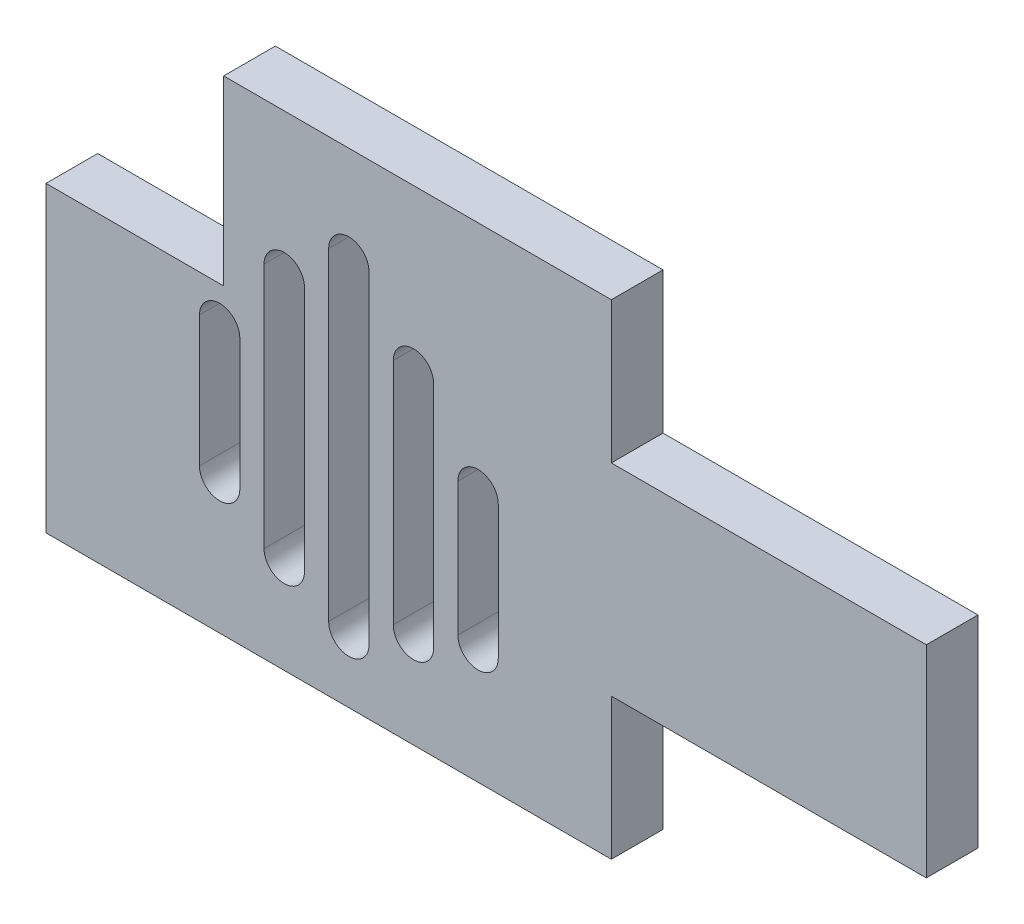
ISO-10303-21;
HEADER;
FILE_DESCRIPTION(('STEP AP214'),'2;1');
FILE_NAME('part.step','',(''),(''),'','','');
FILE_SCHEMA(('AUTOMOTIVE_DESIGN { 1 0 10303 214 1 1 1 1 }'));
ENDSEC;
DATA;
#1=APPLICATION_CONTEXT('core data for automotive mechanical design processes');
#2=APPLICATION_PROTOCOL_DEFINITION('international standard','automotive_design',2000,#1);
#3=PRODUCT_CONTEXT('',#1,'mechanical');
#4=PRODUCT('Part','Part','',(#3));
#5=PRODUCT_RELATED_PRODUCT_CATEGORY('part','',(#4));
#6=PRODUCT_DEFINITION_FORMATION('','',#4);
#7=PRODUCT_DEFINITION_CONTEXT('part definition',#1,'design');
#8=PRODUCT_DEFINITION('design','',#6,#7);
#9=PRODUCT_DEFINITION_SHAPE('','',#8);
#10=(LENGTH_UNIT() NAMED_UNIT(*) SI_UNIT(.MILLI.,.METRE.));
#11=(NAMED_UNIT(*) PLANE_ANGLE_UNIT() SI_UNIT($,.RADIAN.));
#12=(NAMED_UNIT(*) SI_UNIT($,.STERADIAN.) SOLID_ANGLE_UNIT());
#13=UNCERTAINTY_MEASURE_WITH_UNIT(LENGTH_MEASURE(1.E-05),#10,'distance_accuracy_value','');
#14=(GEOMETRIC_REPRESENTATION_CONTEXT(3) GLOBAL_UNCERTAINTY_ASSIGNED_CONTEXT((#13)) GLOBAL_UNIT_ASSIGNED_CONTEXT((#10,
#11,#12)) REPRESENTATION_CONTEXT('',''));
#15=CARTESIAN_POINT('',(0.,0.,0.));
#16=DIRECTION('',(0.,0.,1.));
#17=DIRECTION('',(1.,0.,0.));
#18=AXIS2_PLACEMENT_3D('',#15,#16,#17);
#19=CARTESIAN_POINT('',(0.,0.,6.4));
#20=DIRECTION('',(0.,0.,1.));
#21=DIRECTION('',(1.,0.,0.));
#22=AXIS2_PLACEMENT_3D('',#19,#20,#21);
#23=PLANE('',#22);
#24=DIRECTION('',(1.,0.,0.));
#25=VECTOR('',#24,1.);
#26=CARTESIAN_POINT('',(30.8627181714712,-9.00594586937473,6.4));
#27=LINE('',#26,#25);
#28=CARTESIAN_POINT('',(-39.1372818285288,-9.00594586937474,6.4));
#29=VERTEX_POINT('',#28);
#30=CARTESIAN_POINT('',(30.8627181714712,-9.00594586937473,6.4));
#31=VERTEX_POINT('',#30);
#32=EDGE_CURVE('E390',#29,#31,#27,.T.);
#33=ORIENTED_EDGE('',*,*,#32,.T.);
#34=DIRECTION('',(0.,1.,0.));
#35=VECTOR('',#34,1.);
#36=CARTESIAN_POINT('',(30.8627181714712,8.49405413062527,6.4));
#37=LINE('',#36,#35);
#38=CARTESIAN_POINT('',(30.8627181714712,8.49405413062527,6.4));
#39=VERTEX_POINT('',#38);
#40=EDGE_CURVE('E393',#31,#39,#37,.T.);
#41=ORIENTED_EDGE('',*,*,#40,.T.);
#42=DIRECTION('',(1.,0.,0.));
#43=VECTOR('',#42,1.);
#44=CARTESIAN_POINT('',(30.8627181714712,8.49405413062527,6.4));
#45=LINE('',#44,#43);
#46=CARTESIAN_POINT('',(69.8627181714712,8.49405413062527,6.4));
#47=VERTEX_POINT('',#46);
#48=EDGE_CURVE('E396',#39,#47,#45,.T.);
#49=ORIENTED_EDGE('',*,*,#48,.T.);
#50=DIRECTION('',(0.,1.,0.));
#51=VECTOR('',#50,1.);
#52=CARTESIAN_POINT('',(69.8627181714712,33.4940541306253,6.4));
#53=LINE('',#52,#51);
#54=CARTESIAN_POINT('',(69.8627181714712,33.4940541306253,6.4));
#55=VERTEX_POINT('',#54);
#56=EDGE_CURVE('E398',#47,#55,#53,.T.);
#57=ORIENTED_EDGE('',*,*,#56,.T.);
#58=DIRECTION('',(-1.,0.,0.));
#59=VECTOR('',#58,1.);
#60=CARTESIAN_POINT('',(30.8627181714712,33.4940541306253,6.4));
#61=LINE('',#60,#59);
#62=CARTESIAN_POINT('',(30.8627181714712,33.4940541306253,6.4));
#63=VERTEX_POINT('',#62);
#64=EDGE_CURVE('E400',#55,#63,#61,.T.);
#65=ORIENTED_EDGE('',*,*,#64,.T.);
#66=DIRECTION('',(0.,1.,0.));
#67=VECTOR('',#66,1.);
#68=CARTESIAN_POINT('',(30.8627181714712,50.9940541306253,6.4));
#69=LINE('',#68,#67);
#70=CARTESIAN_POINT('',(30.8627181714712,50.9940541306253,6.4));
#71=VERTEX_POINT('',#70);
#72=EDGE_CURVE('E402',#63,#71,#69,.T.);
#73=ORIENTED_EDGE('',*,*,#72,.T.);
#74=DIRECTION('',(-1.,0.,0.));
#75=VECTOR('',#74,1.);
#76=CARTESIAN_POINT('',(30.8627181714712,50.9940541306253,6.4));
#77=LINE('',#76,#75);
#78=CARTESIAN_POINT('',(-17.1372818285288,50.9940541306253,6.4));
#79=VERTEX_POINT('',#78);
#80=EDGE_CURVE('E404',#71,#79,#77,.T.);
#81=ORIENTED_EDGE('',*,*,#80,.T.);
#82=DIRECTION('',(0.,-1.,0.));
#83=VECTOR('',#82,1.);
#84=CARTESIAN_POINT('',(-17.1372818285288,50.9940541306253,6.4));
#85=LINE('',#84,#83);
#86=CARTESIAN_POINT('',(-17.1372818285288,28.4723046370912,6.4));
#87=VERTEX_POINT('',#86);
#88=EDGE_CURVE('E406',#79,#87,#85,.T.);
#89=ORIENTED_EDGE('',*,*,#88,.T.);
#90=DIRECTION('',(-1.,0.,0.));
#91=VECTOR('',#90,1.);
#92=CARTESIAN_POINT('',(-17.1372818285288,28.4723046370912,6.4));
#93=LINE('',#92,#91);
#94=CARTESIAN_POINT('',(-39.1372818285288,28.4723046370912,6.4));
#95=VERTEX_POINT('',#94);
#96=EDGE_CURVE('E408',#87,#95,#93,.T.);
#97=ORIENTED_EDGE('',*,*,#96,.T.);
#98=DIRECTION('',(0.,-1.,0.));
#99=VECTOR('',#98,1.);
#100=CARTESIAN_POINT('',(-39.1372818285288,28.4723046370912,6.4));
#101=LINE('',#100,#99);
#102=EDGE_CURVE('E410',#95,#29,#101,.T.);
#103=ORIENTED_EDGE('',*,*,#102,.T.);
#104=EDGE_LOOP('',(#33,#41,#49,#57,#65,#73,#81,#89,#97,#103));
#105=FACE_BOUND('',#104,.T.);
#106=DIRECTION('',(0.,-1.,0.));
#107=VECTOR('',#106,1.);
#108=CARTESIAN_POINT('',(-4.13728182852882,38.9940541306252,6.4));
#109=LINE('',#108,#107);
#110=CARTESIAN_POINT('',(-4.13728182852882,38.9940541306252,6.4));
#111=VERTEX_POINT('',#110);
#112=CARTESIAN_POINT('',(-4.13728182852882,-1.00594586937475,6.4));
#113=VERTEX_POINT('',#112);
#114=EDGE_CURVE('E361',#111,#113,#109,.T.);
#115=ORIENTED_EDGE('',*,*,#114,.F.);
#116=CARTESIAN_POINT('',(-1.63728182852882,38.9940541306252,6.4));
#117=DIRECTION('',(0.,0.,1.));
#118=DIRECTION('',(-1.,0.,0.));
#119=AXIS2_PLACEMENT_3D('',#116,#117,#118);
#120=CIRCLE('',#119,2.5);
#121=CARTESIAN_POINT('',(0.862718171471179,38.9940541306252,6.4));
#122=VERTEX_POINT('',#121);
#123=EDGE_CURVE('E359',#122,#111,#120,.T.);
#124=ORIENTED_EDGE('',*,*,#123,.F.);
#125=DIRECTION('',(0.,1.,0.));
#126=VECTOR('',#125,1.);
#127=CARTESIAN_POINT('',(0.862718171471179,38.9940541306252,6.4));
#128=LINE('',#127,#126);
#129=CARTESIAN_POINT('',(0.862718171471179,-1.00594586937475,6.4));
#130=VERTEX_POINT('',#129);
#131=EDGE_CURVE('E367',#130,#122,#128,.T.);
#132=ORIENTED_EDGE('',*,*,#131,.F.);
#133=CARTESIAN_POINT('',(-1.63728182852882,-1.00594586937475,6.4));
#134=DIRECTION('',(0.,0.,1.));
#135=DIRECTION('',(-1.,0.,0.));
#136=AXIS2_PLACEMENT_3D('',#133,#134,#135);
#137=CIRCLE('',#136,2.5);
#138=EDGE_CURVE('E364',#113,#130,#137,.T.);
#139=ORIENTED_EDGE('',*,*,#138,.F.);
#140=EDGE_LOOP('',(#115,#124,#132,#139));
#141=FACE_BOUND('',#140,.T.);
#142=DIRECTION('',(0.,-1.,0.));
#143=VECTOR('',#142,1.);
#144=CARTESIAN_POINT('',(-12.1372818285288,33.3124319025332,6.4));
#145=LINE('',#144,#143);
#146=CARTESIAN_POINT('',(-12.1372818285288,33.3124319025332,6.4));
#147=VERTEX_POINT('',#146);
#148=CARTESIAN_POINT('',(-12.1372818285288,2.80982789630503,6.4));
#149=VERTEX_POINT('',#148);
#150=EDGE_CURVE('E330',#147,#149,#145,.T.);
#151=ORIENTED_EDGE('',*,*,#150,.F.);
#152=CARTESIAN_POINT('',(-9.63728182852882,33.3124319025332,6.4));
#153=DIRECTION('',(0.,0.,1.));
#154=DIRECTION('',(-1.,0.,0.));
#155=AXIS2_PLACEMENT_3D('',#152,#153,#154);
#156=CIRCLE('',#155,2.5);
#157=CARTESIAN_POINT('',(-7.13728182852882,33.3124319025332,6.4));
#158=VERTEX_POINT('',#157);
#159=EDGE_CURVE('E328',#158,#147,#156,.T.);
#160=ORIENTED_EDGE('',*,*,#159,.F.);
#161=DIRECTION('',(0.,1.,0.));
#162=VECTOR('',#161,1.);
#163=CARTESIAN_POINT('',(-7.13728182852882,33.3124319025332,6.4));
#164=LINE('',#163,#162);
#165=CARTESIAN_POINT('',(-7.13728182852882,2.80982789630503,6.4));
#166=VERTEX_POINT('',#165);
#167=EDGE_CURVE('E336',#166,#158,#164,.T.);
#168=ORIENTED_EDGE('',*,*,#167,.F.);
#169=CARTESIAN_POINT('',(-9.63728182852882,2.80982789630503,6.4));
#170=DIRECTION('',(0.,0.,1.));
#171=DIRECTION('',(1.,0.,0.));
#172=AXIS2_PLACEMENT_3D('',#169,#170,#171);
#173=CIRCLE('',#172,2.5);
#174=EDGE_CURVE('E333',#149,#166,#173,.T.);
#175=ORIENTED_EDGE('',*,*,#174,.F.);
#176=EDGE_LOOP('',(#151,#160,#168,#175));
#177=FACE_BOUND('',#176,.T.);
#178=DIRECTION('',(0.,-1.,0.));
#179=VECTOR('',#178,1.);
#180=CARTESIAN_POINT('',(-20.1372818285288,23.8612835886495,6.4));
#181=LINE('',#180,#179);
#182=CARTESIAN_POINT('',(-20.1372818285288,23.8612835886495,6.4));
#183=VERTEX_POINT('',#182);
#184=CARTESIAN_POINT('',(-20.1372818285288,7.68344946237683,6.4));
#185=VERTEX_POINT('',#184);
#186=EDGE_CURVE('E299',#183,#185,#181,.T.);
#187=ORIENTED_EDGE('',*,*,#186,.F.);
#188=CARTESIAN_POINT('',(-17.6372818285288,23.8612835886495,6.4));
#189=DIRECTION('',(0.,0.,1.));
#190=DIRECTION('',(1.,0.,0.));
#191=AXIS2_PLACEMENT_3D('',#188,#189,#190);
#192=CIRCLE('',#191,2.5);
#193=CARTESIAN_POINT('',(-15.1372818285288,23.8612835886495,6.4));
#194=VERTEX_POINT('',#193);
#195=EDGE_CURVE('E297',#194,#183,#192,.T.);
#196=ORIENTED_EDGE('',*,*,#195,.F.);
#197=DIRECTION('',(0.,1.,0.));
#198=VECTOR('',#197,1.);
#199=CARTESIAN_POINT('',(-15.1372818285288,23.8612835886495,6.4));
#200=LINE('',#199,#198);
#201=CARTESIAN_POINT('',(-15.1372818285288,7.68344946237683,6.4));
#202=VERTEX_POINT('',#201);
#203=EDGE_CURVE('E305',#202,#194,#200,.T.);
#204=ORIENTED_EDGE('',*,*,#203,.F.);
#205=CARTESIAN_POINT('',(-17.6372818285288,7.68344946237683,6.4));
#206=DIRECTION('',(0.,0.,1.));
#207=DIRECTION('',(1.,0.,0.));
#208=AXIS2_PLACEMENT_3D('',#205,#206,#207);
#209=CIRCLE('',#208,2.5);
#210=EDGE_CURVE('E302',#185,#202,#209,.T.);
#211=ORIENTED_EDGE('',*,*,#210,.F.);
#212=EDGE_LOOP('',(#187,#196,#204,#211));
#213=FACE_BOUND('',#212,.T.);
#214=DIRECTION('',(0.,-1.,0.));
#215=VECTOR('',#214,1.);
#216=CARTESIAN_POINT('',(3.86271817147118,30.9940541306252,6.4));
#217=LINE('',#216,#215);
#218=CARTESIAN_POINT('',(3.86271817147118,30.9940541306252,6.4));
#219=VERTEX_POINT('',#218);
#220=CARTESIAN_POINT('',(3.86271817147118,2.64743444309961,6.4));
#221=VERTEX_POINT('',#220);
#222=EDGE_CURVE('E268',#219,#221,#217,.T.);
#223=ORIENTED_EDGE('',*,*,#222,.F.);
#224=CARTESIAN_POINT('',(6.36271817147118,30.9940541306252,6.4));
#225=DIRECTION('',(0.,0.,1.));
#226=DIRECTION('',(1.,0.,0.));
#227=AXIS2_PLACEMENT_3D('',#224,#225,#226);
#228=CIRCLE('',#227,2.5);
#229=CARTESIAN_POINT('',(8.86271817147118,30.9940541306252,6.4));
#230=VERTEX_POINT('',#229);
#231=EDGE_CURVE('E266',#230,#219,#228,.T.);
#232=ORIENTED_EDGE('',*,*,#231,.F.);
#233=DIRECTION('',(0.,1.,0.));
#234=VECTOR('',#233,1.);
#235=CARTESIAN_POINT('',(8.86271817147118,30.9940541306252,6.4));
#236=LINE('',#235,#234);
#237=CARTESIAN_POINT('',(8.86271817147118,2.64743444309961,6.4));
#238=VERTEX_POINT('',#237);
#239=EDGE_CURVE('E274',#238,#230,#236,.T.);
#240=ORIENTED_EDGE('',*,*,#239,.F.);
#241=CARTESIAN_POINT('',(6.36271817147118,2.64743444309961,6.4));
#242=DIRECTION('',(0.,0.,1.));
#243=DIRECTION('',(1.,0.,0.));
#244=AXIS2_PLACEMENT_3D('',#241,#242,#243);
#245=CIRCLE('',#244,2.5);
#246=EDGE_CURVE('E271',#221,#238,#245,.T.);
#247=ORIENTED_EDGE('',*,*,#246,.F.);
#248=EDGE_LOOP('',(#223,#232,#240,#247));
#249=FACE_BOUND('',#248,.T.);
#250=DIRECTION('',(0.,-1.,0.));
#251=VECTOR('',#250,1.);
#252=CARTESIAN_POINT('',(11.8627181714712,22.0482710062122,6.4));
#253=LINE('',#252,#251);
#254=CARTESIAN_POINT('',(11.8627181714712,22.0482710062122,6.4));
#255=VERTEX_POINT('',#254);
#256=CARTESIAN_POINT('',(11.8627181714712,5.53847301170768,6.4));
#257=VERTEX_POINT('',#256);
#258=EDGE_CURVE('E238',#255,#257,#253,.T.);
#259=ORIENTED_EDGE('',*,*,#258,.F.);
#260=CARTESIAN_POINT('',(14.3627181714712,22.0482710062122,6.4));
#261=DIRECTION('',(0.,0.,1.));
#262=DIRECTION('',(1.,0.,0.));
#263=AXIS2_PLACEMENT_3D('',#260,#261,#262);
#264=CIRCLE('',#263,2.5);
#265=CARTESIAN_POINT('',(16.8627181714712,22.0482710062122,6.4));
#266=VERTEX_POINT('',#265);
#267=EDGE_CURVE('E230',#266,#255,#264,.T.);
#268=ORIENTED_EDGE('',*,*,#267,.F.);
#269=DIRECTION('',(0.,1.,0.));
#270=VECTOR('',#269,1.);
#271=CARTESIAN_POINT('',(16.8627181714712,22.0482710062122,6.4));
#272=LINE('',#271,#270);
#273=CARTESIAN_POINT('',(16.8627181714712,5.53847301170768,6.4));
#274=VERTEX_POINT('',#273);
#275=EDGE_CURVE('E252',#274,#266,#272,.T.);
#276=ORIENTED_EDGE('',*,*,#275,.F.);
#277=CARTESIAN_POINT('',(14.3627181714712,5.53847301170768,6.4));
#278=DIRECTION('',(0.,0.,1.));
#279=DIRECTION('',(1.,0.,0.));
#280=AXIS2_PLACEMENT_3D('',#277,#278,#279);
#281=CIRCLE('',#280,2.5);
#282=EDGE_CURVE('E250',#257,#274,#281,.T.);
#283=ORIENTED_EDGE('',*,*,#282,.F.);
#284=EDGE_LOOP('',(#259,#268,#276,#283));
#285=FACE_BOUND('',#284,.T.);
#286=ADVANCED_FACE('F33',(#105,#141,#177,#213,#249,#285),#23,.T.);
#287=CARTESIAN_POINT('',(0.,0.,0.));
#288=DIRECTION('',(0.,0.,1.));
#289=DIRECTION('',(1.,0.,0.));
#290=AXIS2_PLACEMENT_3D('',#287,#288,#289);
#291=PLANE('',#290);
#292=CARTESIAN_POINT('',(6.36271817147118,30.9940541306252,0.));
#293=DIRECTION('',(0.,0.,1.));
#294=DIRECTION('',(1.,0.,0.));
#295=AXIS2_PLACEMENT_3D('',#292,#293,#294);
#296=CIRCLE('',#295,2.5);
#297=CARTESIAN_POINT('',(8.86271817147118,30.9940541306252,0.));
#298=VERTEX_POINT('',#297);
#299=CARTESIAN_POINT('',(3.86271817147118,30.9940541306252,0.));
#300=VERTEX_POINT('',#299);
#301=EDGE_CURVE('E246',#298,#300,#296,.T.);
#302=ORIENTED_EDGE('',*,*,#301,.T.);
#303=DIRECTION('',(0.,-1.,0.));
#304=VECTOR('',#303,1.);
#305=CARTESIAN_POINT('',(3.86271817147118,30.9940541306252,0.));
#306=LINE('',#305,#304);
#307=CARTESIAN_POINT('',(3.86271817147118,2.64743444309961,0.));
#308=VERTEX_POINT('',#307);
#309=EDGE_CURVE('E279',#300,#308,#306,.T.);
#310=ORIENTED_EDGE('',*,*,#309,.T.);
#311=CARTESIAN_POINT('',(6.36271817147118,2.64743444309961,0.));
#312=DIRECTION('',(0.,0.,1.));
#313=DIRECTION('',(1.,0.,0.));
#314=AXIS2_PLACEMENT_3D('',#311,#312,#313);
#315=CIRCLE('',#314,2.5);
#316=CARTESIAN_POINT('',(8.86271817147118,2.64743444309961,0.));
#317=VERTEX_POINT('',#316);
#318=EDGE_CURVE('E282',#308,#317,#315,.T.);
#319=ORIENTED_EDGE('',*,*,#318,.T.);
#320=DIRECTION('',(0.,1.,0.));
#321=VECTOR('',#320,1.);
#322=CARTESIAN_POINT('',(8.86271817147118,30.9940541306252,0.));
#323=LINE('',#322,#321);
#324=EDGE_CURVE('E269',#317,#298,#323,.T.);
#325=ORIENTED_EDGE('',*,*,#324,.T.);
#326=EDGE_LOOP('',(#302,#310,#319,#325));
#327=FACE_BOUND('',#326,.T.);
#328=CARTESIAN_POINT('',(-9.63728182852882,33.3124319025332,0.));
#329=DIRECTION('',(0.,0.,1.));
#330=DIRECTION('',(-1.,0.,0.));
#331=AXIS2_PLACEMENT_3D('',#328,#329,#330);
#332=CIRCLE('',#331,2.5);
#333=CARTESIAN_POINT('',(-7.13728182852882,33.3124319025332,0.));
#334=VERTEX_POINT('',#333);
#335=CARTESIAN_POINT('',(-12.1372818285288,33.3124319025332,0.));
#336=VERTEX_POINT('',#335);
#337=EDGE_CURVE('E327',#334,#336,#332,.T.);
#338=ORIENTED_EDGE('',*,*,#337,.T.);
#339=DIRECTION('',(0.,-1.,0.));
#340=VECTOR('',#339,1.);
#341=CARTESIAN_POINT('',(-12.1372818285288,33.3124319025332,0.));
#342=LINE('',#341,#340);
#343=CARTESIAN_POINT('',(-12.1372818285288,2.80982789630503,0.));
#344=VERTEX_POINT('',#343);
#345=EDGE_CURVE('E341',#336,#344,#342,.T.);
#346=ORIENTED_EDGE('',*,*,#345,.T.);
#347=CARTESIAN_POINT('',(-9.63728182852882,2.80982789630503,0.));
#348=DIRECTION('',(0.,0.,1.));
#349=DIRECTION('',(1.,0.,0.));
#350=AXIS2_PLACEMENT_3D('',#347,#348,#349);
#351=CIRCLE('',#350,2.5);
#352=CARTESIAN_POINT('',(-7.13728182852882,2.80982789630503,0.));
#353=VERTEX_POINT('',#352);
#354=EDGE_CURVE('E344',#344,#353,#351,.T.);
#355=ORIENTED_EDGE('',*,*,#354,.T.);
#356=DIRECTION('',(0.,1.,0.));
#357=VECTOR('',#356,1.);
#358=CARTESIAN_POINT('',(-7.13728182852882,33.3124319025332,0.));
#359=LINE('',#358,#357);
#360=EDGE_CURVE('E331',#353,#334,#359,.T.);
#361=ORIENTED_EDGE('',*,*,#360,.T.);
#362=EDGE_LOOP('',(#338,#346,#355,#361));
#363=FACE_BOUND('',#362,.T.);
#364=DIRECTION('',(1.,0.,0.));
#365=VECTOR('',#364,1.);
#366=CARTESIAN_POINT('',(30.8627181714712,-9.00594586937473,0.));
#367=LINE('',#366,#365);
#368=CARTESIAN_POINT('',(-39.1372818285288,-9.00594586937474,0.));
#369=VERTEX_POINT('',#368);
#370=CARTESIAN_POINT('',(30.8627181714712,-9.00594586937473,0.));
#371=VERTEX_POINT('',#370);
#372=EDGE_CURVE('E389',#369,#371,#367,.T.);
#373=ORIENTED_EDGE('',*,*,#372,.F.);
#374=DIRECTION('',(0.,-1.,0.));
#375=VECTOR('',#374,1.);
#376=CARTESIAN_POINT('',(-39.1372818285288,28.4723046370912,0.));
#377=LINE('',#376,#375);
#378=CARTESIAN_POINT('',(-39.1372818285288,28.4723046370912,0.));
#379=VERTEX_POINT('',#378);
#380=EDGE_CURVE('E394',#379,#369,#377,.T.);
#381=ORIENTED_EDGE('',*,*,#380,.F.);
#382=DIRECTION('',(-1.,0.,0.));
#383=VECTOR('',#382,1.);
#384=CARTESIAN_POINT('',(-17.1372818285288,28.4723046370912,0.));
#385=LINE('',#384,#383);
#386=CARTESIAN_POINT('',(-17.1372818285288,28.4723046370912,0.));
#387=VERTEX_POINT('',#386);
#388=EDGE_CURVE('E429',#387,#379,#385,.T.);
#389=ORIENTED_EDGE('',*,*,#388,.F.);
#390=DIRECTION('',(0.,-1.,0.));
#391=VECTOR('',#390,1.);
#392=CARTESIAN_POINT('',(-17.1372818285288,50.9940541306253,0.));
#393=LINE('',#392,#391);
#394=CARTESIAN_POINT('',(-17.1372818285288,50.9940541306253,0.));
#395=VERTEX_POINT('',#394);
#396=EDGE_CURVE('E427',#395,#387,#393,.T.);
#397=ORIENTED_EDGE('',*,*,#396,.F.);
#398=DIRECTION('',(-1.,0.,0.));
#399=VECTOR('',#398,1.);
#400=CARTESIAN_POINT('',(30.8627181714712,50.9940541306253,0.));
#401=LINE('',#400,#399);
#402=CARTESIAN_POINT('',(30.8627181714712,50.9940541306253,0.));
#403=VERTEX_POINT('',#402);
#404=EDGE_CURVE('E425',#403,#395,#401,.T.);
#405=ORIENTED_EDGE('',*,*,#404,.F.);
#406=DIRECTION('',(0.,1.,0.));
#407=VECTOR('',#406,1.);
#408=CARTESIAN_POINT('',(30.8627181714712,50.9940541306253,0.));
#409=LINE('',#408,#407);
#410=CARTESIAN_POINT('',(30.8627181714712,33.4940541306253,0.));
#411=VERTEX_POINT('',#410);
#412=EDGE_CURVE('E423',#411,#403,#409,.T.);
#413=ORIENTED_EDGE('',*,*,#412,.F.);
#414=DIRECTION('',(-1.,0.,0.));
#415=VECTOR('',#414,1.);
#416=CARTESIAN_POINT('',(30.8627181714712,33.4940541306253,0.));
#417=LINE('',#416,#415);
#418=CARTESIAN_POINT('',(69.8627181714712,33.4940541306253,0.));
#419=VERTEX_POINT('',#418);
#420=EDGE_CURVE('E421',#419,#411,#417,.T.);
#421=ORIENTED_EDGE('',*,*,#420,.F.);
#422=DIRECTION('',(0.,1.,0.));
#423=VECTOR('',#422,1.);
#424=CARTESIAN_POINT('',(69.8627181714712,33.4940541306253,0.));
#425=LINE('',#424,#423);
#426=CARTESIAN_POINT('',(69.8627181714712,8.49405413062527,0.));
#427=VERTEX_POINT('',#426);
#428=EDGE_CURVE('E419',#427,#419,#425,.T.);
#429=ORIENTED_EDGE('',*,*,#428,.F.);
#430=DIRECTION('',(1.,0.,0.));
#431=VECTOR('',#430,1.);
#432=CARTESIAN_POINT('',(30.8627181714712,8.49405413062527,0.));
#433=LINE('',#432,#431);
#434=CARTESIAN_POINT('',(30.8627181714712,8.49405413062527,0.));
#435=VERTEX_POINT('',#434);
#436=EDGE_CURVE('E417',#435,#427,#433,.T.);
#437=ORIENTED_EDGE('',*,*,#436,.F.);
#438=DIRECTION('',(0.,1.,0.));
#439=VECTOR('',#438,1.);
#440=CARTESIAN_POINT('',(30.8627181714712,8.49405413062527,0.));
#441=LINE('',#440,#439);
#442=EDGE_CURVE('E415',#371,#435,#441,.T.);
#443=ORIENTED_EDGE('',*,*,#442,.F.);
#444=EDGE_LOOP('',(#373,#381,#389,#397,#405,#413,#421,#429,#437,#443));
#445=FACE_BOUND('',#444,.T.);
#446=CARTESIAN_POINT('',(-1.63728182852882,38.9940541306252,0.));
#447=DIRECTION('',(0.,0.,1.));
#448=DIRECTION('',(-1.,0.,0.));
#449=AXIS2_PLACEMENT_3D('',#446,#447,#448);
#450=CIRCLE('',#449,2.5);
#451=CARTESIAN_POINT('',(0.862718171471179,38.9940541306252,0.));
#452=VERTEX_POINT('',#451);
#453=CARTESIAN_POINT('',(-4.13728182852882,38.9940541306252,0.));
#454=VERTEX_POINT('',#453);
#455=EDGE_CURVE('E358',#452,#454,#450,.T.);
#456=ORIENTED_EDGE('',*,*,#455,.T.);
#457=DIRECTION('',(0.,-1.,0.));
#458=VECTOR('',#457,1.);
#459=CARTESIAN_POINT('',(-4.13728182852882,38.9940541306252,0.));
#460=LINE('',#459,#458);
#461=CARTESIAN_POINT('',(-4.13728182852882,-1.00594586937475,0.));
#462=VERTEX_POINT('',#461);
#463=EDGE_CURVE('E372',#454,#462,#460,.T.);
#464=ORIENTED_EDGE('',*,*,#463,.T.);
#465=CARTESIAN_POINT('',(-1.63728182852882,-1.00594586937475,0.));
#466=DIRECTION('',(0.,0.,1.));
#467=DIRECTION('',(-1.,0.,0.));
#468=AXIS2_PLACEMENT_3D('',#465,#466,#467);
#469=CIRCLE('',#468,2.5);
#470=CARTESIAN_POINT('',(0.862718171471174,-1.00594586937475,0.));
#471=VERTEX_POINT('',#470);
#472=EDGE_CURVE('E375',#462,#471,#469,.T.);
#473=ORIENTED_EDGE('',*,*,#472,.T.);
#474=DIRECTION('',(0.,1.,0.));
#475=VECTOR('',#474,1.);
#476=CARTESIAN_POINT('',(0.862718171471179,38.9940541306252,0.));
#477=LINE('',#476,#475);
#478=EDGE_CURVE('E362',#471,#452,#477,.T.);
#479=ORIENTED_EDGE('',*,*,#478,.T.);
#480=EDGE_LOOP('',(#456,#464,#473,#479));
#481=FACE_BOUND('',#480,.T.);
#482=CARTESIAN_POINT('',(-17.6372818285288,23.8612835886495,0.));
#483=DIRECTION('',(0.,0.,1.));
#484=DIRECTION('',(1.,0.,0.));
#485=AXIS2_PLACEMENT_3D('',#482,#483,#484);
#486=CIRCLE('',#485,2.5);
#487=CARTESIAN_POINT('',(-15.1372818285288,23.8612835886495,0.));
#488=VERTEX_POINT('',#487);
#489=CARTESIAN_POINT('',(-20.1372818285288,23.8612835886495,0.));
#490=VERTEX_POINT('',#489);
#491=EDGE_CURVE('E296',#488,#490,#486,.T.);
#492=ORIENTED_EDGE('',*,*,#491,.T.);
#493=DIRECTION('',(0.,-1.,0.));
#494=VECTOR('',#493,1.);
#495=CARTESIAN_POINT('',(-20.1372818285288,23.8612835886495,0.));
#496=LINE('',#495,#494);
#497=CARTESIAN_POINT('',(-20.1372818285288,7.68344946237683,0.));
#498=VERTEX_POINT('',#497);
#499=EDGE_CURVE('E310',#490,#498,#496,.T.);
#500=ORIENTED_EDGE('',*,*,#499,.T.);
#501=CARTESIAN_POINT('',(-17.6372818285288,7.68344946237683,0.));
#502=DIRECTION('',(0.,0.,1.));
#503=DIRECTION('',(1.,0.,0.));
#504=AXIS2_PLACEMENT_3D('',#501,#502,#503);
#505=CIRCLE('',#504,2.5);
#506=CARTESIAN_POINT('',(-15.1372818285288,7.68344946237683,0.));
#507=VERTEX_POINT('',#506);
#508=EDGE_CURVE('E313',#498,#507,#505,.T.);
#509=ORIENTED_EDGE('',*,*,#508,.T.);
#510=DIRECTION('',(0.,1.,0.));
#511=VECTOR('',#510,1.);
#512=CARTESIAN_POINT('',(-15.1372818285288,23.8612835886495,0.));
#513=LINE('',#512,#511);
#514=EDGE_CURVE('E300',#507,#488,#513,.T.);
#515=ORIENTED_EDGE('',*,*,#514,.T.);
#516=EDGE_LOOP('',(#492,#500,#509,#515));
#517=FACE_BOUND('',#516,.T.);
#518=CARTESIAN_POINT('',(14.3627181714712,22.0482710062122,0.));
#519=DIRECTION('',(0.,0.,1.));
#520=DIRECTION('',(1.,0.,0.));
#521=AXIS2_PLACEMENT_3D('',#518,#519,#520);
#522=CIRCLE('',#521,2.5);
#523=CARTESIAN_POINT('',(16.8627181714712,22.0482710062122,0.));
#524=VERTEX_POINT('',#523);
#525=CARTESIAN_POINT('',(11.8627181714712,22.0482710062122,0.));
#526=VERTEX_POINT('',#525);
#527=EDGE_CURVE('E56',#524,#526,#522,.T.);
#528=ORIENTED_EDGE('',*,*,#527,.T.);
#529=DIRECTION('',(0.,-1.,0.));
#530=VECTOR('',#529,1.);
#531=CARTESIAN_POINT('',(11.8627181714712,22.0482710062122,0.));
#532=LINE('',#531,#530);
#533=CARTESIAN_POINT('',(11.8627181714712,5.53847301170768,0.));
#534=VERTEX_POINT('',#533);
#535=EDGE_CURVE('E245',#526,#534,#532,.T.);
#536=ORIENTED_EDGE('',*,*,#535,.T.);
#537=CARTESIAN_POINT('',(14.3627181714712,5.53847301170768,0.));
#538=DIRECTION('',(0.,0.,1.));
#539=DIRECTION('',(1.,0.,0.));
#540=AXIS2_PLACEMENT_3D('',#537,#538,#539);
#541=CIRCLE('',#540,2.5);
#542=CARTESIAN_POINT('',(16.8627181714712,5.53847301170768,0.));
#543=VERTEX_POINT('',#542);
#544=EDGE_CURVE('E258',#534,#543,#541,.T.);
#545=ORIENTED_EDGE('',*,*,#544,.T.);
#546=DIRECTION('',(0.,1.,0.));
#547=VECTOR('',#546,1.);
#548=CARTESIAN_POINT('',(16.8627181714712,22.0482710062122,0.));
#549=LINE('',#548,#547);
#550=EDGE_CURVE('E239',#543,#524,#549,.T.);
#551=ORIENTED_EDGE('',*,*,#550,.T.);
#552=EDGE_LOOP('',(#528,#536,#545,#551));
#553=FACE_BOUND('',#552,.T.);
#554=ADVANCED_FACE('F465',(#327,#363,#445,#481,#517,#553),#291,.F.);
#555=CARTESIAN_POINT('',(30.8627181714712,-9.00594586937473,6.4));
#556=DIRECTION('',(0.,1.,0.));
#557=DIRECTION('',(-1.,0.,0.));
#558=AXIS2_PLACEMENT_3D('',#555,#556,#557);
#559=PLANE('',#558);
#560=ORIENTED_EDGE('',*,*,#372,.T.);
#561=DIRECTION('',(0.,0.,-1.));
#562=VECTOR('',#561,1.);
#563=CARTESIAN_POINT('',(30.8627181714712,-9.00594586937473,6.4));
#564=LINE('',#563,#562);
#565=EDGE_CURVE('E11',#31,#371,#564,.T.);
#566=ORIENTED_EDGE('',*,*,#565,.F.);
#567=ORIENTED_EDGE('',*,*,#32,.F.);
#568=DIRECTION('',(0.,0.,-1.));
#569=VECTOR('',#568,1.);
#570=CARTESIAN_POINT('',(-39.1372818285288,-9.00594586937474,6.4));
#571=LINE('',#570,#569);
#572=EDGE_CURVE('E412',#29,#369,#571,.T.);
#573=ORIENTED_EDGE('',*,*,#572,.T.);
#574=EDGE_LOOP('',(#560,#566,#567,#573));
#575=FACE_BOUND('',#574,.T.);
#576=ADVANCED_FACE('F35',(#575),#559,.F.);
#577=CARTESIAN_POINT('',(30.8627181714712,8.49405413062527,6.4));
#578=DIRECTION('',(-1.,0.,0.));
#579=DIRECTION('',(0.,0.,1.));
#580=AXIS2_PLACEMENT_3D('',#577,#578,#579);
#581=PLANE('',#580);
#582=ORIENTED_EDGE('',*,*,#442,.T.);
#583=DIRECTION('',(0.,0.,-1.));
#584=VECTOR('',#583,1.);
#585=CARTESIAN_POINT('',(30.8627181714712,8.49405413062527,6.4));
#586=LINE('',#585,#584);
#587=EDGE_CURVE('E41',#39,#435,#586,.T.);
#588=ORIENTED_EDGE('',*,*,#587,.F.);
#589=ORIENTED_EDGE('',*,*,#40,.F.);
#590=ORIENTED_EDGE('',*,*,#565,.T.);
#591=EDGE_LOOP('',(#582,#588,#589,#590));
#592=FACE_BOUND('',#591,.T.);
#593=ADVANCED_FACE('F483',(#592),#581,.F.);
#594=CARTESIAN_POINT('',(30.8627181714712,8.49405413062527,6.4));
#595=DIRECTION('',(0.,1.,0.));
#596=DIRECTION('',(-1.,0.,0.));
#597=AXIS2_PLACEMENT_3D('',#594,#595,#596);
#598=PLANE('',#597);
#599=ORIENTED_EDGE('',*,*,#436,.T.);
#600=DIRECTION('',(0.,0.,-1.));
#601=VECTOR('',#600,1.);
#602=CARTESIAN_POINT('',(69.8627181714712,8.49405413062527,6.4));
#603=LINE('',#602,#601);
#604=EDGE_CURVE('E452',#47,#427,#603,.T.);
#605=ORIENTED_EDGE('',*,*,#604,.F.);
#606=ORIENTED_EDGE('',*,*,#48,.F.);
#607=ORIENTED_EDGE('',*,*,#587,.T.);
#608=EDGE_LOOP('',(#599,#605,#606,#607));
#609=FACE_BOUND('',#608,.T.);
#610=ADVANCED_FACE('F459',(#609),#598,.F.);
#611=CARTESIAN_POINT('',(69.8627181714712,33.4940541306253,6.4));
#612=DIRECTION('',(-1.,0.,0.));
#613=DIRECTION('',(0.,-1.,0.));
#614=AXIS2_PLACEMENT_3D('',#611,#612,#613);
#615=PLANE('',#614);
#616=ORIENTED_EDGE('',*,*,#428,.T.);
#617=DIRECTION('',(0.,0.,-1.));
#618=VECTOR('',#617,1.);
#619=CARTESIAN_POINT('',(69.8627181714712,33.4940541306253,6.4));
#620=LINE('',#619,#618);
#621=EDGE_CURVE('E449',#55,#419,#620,.T.);
#622=ORIENTED_EDGE('',*,*,#621,.F.);
#623=ORIENTED_EDGE('',*,*,#56,.F.);
#624=ORIENTED_EDGE('',*,*,#604,.T.);
#625=EDGE_LOOP('',(#616,#622,#623,#624));
#626=FACE_BOUND('',#625,.T.);
#627=ADVANCED_FACE('F471',(#626),#615,.F.);
#628=CARTESIAN_POINT('',(30.8627181714712,33.4940541306253,6.4));
#629=DIRECTION('',(0.,-1.,0.));
#630=DIRECTION('',(0.,0.,-1.));
#631=AXIS2_PLACEMENT_3D('',#628,#629,#630);
#632=PLANE('',#631);
#633=ORIENTED_EDGE('',*,*,#420,.T.);
#634=DIRECTION('',(0.,0.,-1.));
#635=VECTOR('',#634,1.);
#636=CARTESIAN_POINT('',(30.8627181714712,33.4940541306253,6.4));
#637=LINE('',#636,#635);
#638=EDGE_CURVE('E446',#63,#411,#637,.T.);
#639=ORIENTED_EDGE('',*,*,#638,.F.);
#640=ORIENTED_EDGE('',*,*,#64,.F.);
#641=ORIENTED_EDGE('',*,*,#621,.T.);
#642=EDGE_LOOP('',(#633,#639,#640,#641));
#643=FACE_BOUND('',#642,.T.);
#644=ADVANCED_FACE('F475',(#643),#632,.F.);
#645=CARTESIAN_POINT('',(30.8627181714712,50.9940541306253,6.4));
#646=DIRECTION('',(-1.,0.,0.));
#647=DIRECTION('',(0.,-1.,0.));
#648=AXIS2_PLACEMENT_3D('',#645,#646,#647);
#649=PLANE('',#648);
#650=ORIENTED_EDGE('',*,*,#412,.T.);
#651=DIRECTION('',(0.,0.,-1.));
#652=VECTOR('',#651,1.);
#653=CARTESIAN_POINT('',(30.8627181714712,50.9940541306253,6.4));
#654=LINE('',#653,#652);
#655=EDGE_CURVE('E443',#71,#403,#654,.T.);
#656=ORIENTED_EDGE('',*,*,#655,.F.);
#657=ORIENTED_EDGE('',*,*,#72,.F.);
#658=ORIENTED_EDGE('',*,*,#638,.T.);
#659=EDGE_LOOP('',(#650,#656,#657,#658));
#660=FACE_BOUND('',#659,.T.);
#661=ADVANCED_FACE('F506',(#660),#649,.F.);
#662=CARTESIAN_POINT('',(30.8627181714712,50.9940541306253,6.4));
#663=DIRECTION('',(0.,-1.,0.));
#664=DIRECTION('',(1.,0.,0.));
#665=AXIS2_PLACEMENT_3D('',#662,#663,#664);
#666=PLANE('',#665);
#667=ORIENTED_EDGE('',*,*,#404,.T.);
#668=DIRECTION('',(0.,0.,-1.));
#669=VECTOR('',#668,1.);
#670=CARTESIAN_POINT('',(-17.1372818285288,50.9940541306253,6.4));
#671=LINE('',#670,#669);
#672=EDGE_CURVE('E440',#79,#395,#671,.T.);
#673=ORIENTED_EDGE('',*,*,#672,.F.);
#674=ORIENTED_EDGE('',*,*,#80,.F.);
#675=ORIENTED_EDGE('',*,*,#655,.T.);
#676=EDGE_LOOP('',(#667,#673,#674,#675));
#677=FACE_BOUND('',#676,.T.);
#678=ADVANCED_FACE('F503',(#677),#666,.F.);
#679=CARTESIAN_POINT('',(-17.1372818285288,50.9940541306253,6.4));
#680=DIRECTION('',(1.,0.,0.));
#681=DIRECTION('',(0.,1.,0.));
#682=AXIS2_PLACEMENT_3D('',#679,#680,#681);
#683=PLANE('',#682);
#684=ORIENTED_EDGE('',*,*,#396,.T.);
#685=DIRECTION('',(0.,0.,-1.));
#686=VECTOR('',#685,1.);
#687=CARTESIAN_POINT('',(-17.1372818285288,28.4723046370912,6.4));
#688=LINE('',#687,#686);
#689=EDGE_CURVE('E437',#87,#387,#688,.T.);
#690=ORIENTED_EDGE('',*,*,#689,.F.);
#691=ORIENTED_EDGE('',*,*,#88,.F.);
#692=ORIENTED_EDGE('',*,*,#672,.T.);
#693=EDGE_LOOP('',(#684,#690,#691,#692));
#694=FACE_BOUND('',#693,.T.);
#695=ADVANCED_FACE('F499',(#694),#683,.F.);
#696=CARTESIAN_POINT('',(-17.1372818285288,28.4723046370912,6.4));
#697=DIRECTION('',(0.,-1.,0.));
#698=DIRECTION('',(1.,0.,0.));
#699=AXIS2_PLACEMENT_3D('',#696,#697,#698);
#700=PLANE('',#699);
#701=ORIENTED_EDGE('',*,*,#388,.T.);
#702=DIRECTION('',(0.,0.,-1.));
#703=VECTOR('',#702,1.);
#704=CARTESIAN_POINT('',(-39.1372818285288,28.4723046370912,6.4));
#705=LINE('',#704,#703);
#706=EDGE_CURVE('E434',#95,#379,#705,.T.);
#707=ORIENTED_EDGE('',*,*,#706,.F.);
#708=ORIENTED_EDGE('',*,*,#96,.F.);
#709=ORIENTED_EDGE('',*,*,#689,.T.);
#710=EDGE_LOOP('',(#701,#707,#708,#709));
#711=FACE_BOUND('',#710,.T.);
#712=ADVANCED_FACE('F495',(#711),#700,.F.);
#713=CARTESIAN_POINT('',(-39.1372818285288,28.4723046370912,6.4));
#714=DIRECTION('',(1.,0.,0.));
#715=DIRECTION('',(0.,1.,0.));
#716=AXIS2_PLACEMENT_3D('',#713,#714,#715);
#717=PLANE('',#716);
#718=ORIENTED_EDGE('',*,*,#380,.T.);
#719=ORIENTED_EDGE('',*,*,#572,.F.);
#720=ORIENTED_EDGE('',*,*,#102,.F.);
#721=ORIENTED_EDGE('',*,*,#706,.T.);
#722=EDGE_LOOP('',(#718,#719,#720,#721));
#723=FACE_BOUND('',#722,.T.);
#724=ADVANCED_FACE('F490',(#723),#717,.F.);
#725=CARTESIAN_POINT('',(-1.63728182852882,38.9940541306252,6.4));
#726=DIRECTION('',(0.,0.,-1.));
#727=DIRECTION('',(-1.,0.,0.));
#728=AXIS2_PLACEMENT_3D('',#725,#726,#727);
#729=CYLINDRICAL_SURFACE('',#728,2.5);
#730=ORIENTED_EDGE('',*,*,#455,.F.);
#731=DIRECTION('',(0.,0.,-1.));
#732=VECTOR('',#731,1.);
#733=CARTESIAN_POINT('',(0.862718171471179,38.9940541306252,6.4));
#734=LINE('',#733,#732);
#735=EDGE_CURVE('E369',#122,#452,#734,.T.);
#736=ORIENTED_EDGE('',*,*,#735,.F.);
#737=ORIENTED_EDGE('',*,*,#123,.T.);
#738=DIRECTION('',(0.,0.,-1.));
#739=VECTOR('',#738,1.);
#740=CARTESIAN_POINT('',(-4.13728182852882,38.9940541306252,6.4));
#741=LINE('',#740,#739);
#742=EDGE_CURVE('E386',#111,#454,#741,.T.);
#743=ORIENTED_EDGE('',*,*,#742,.T.);
#744=EDGE_LOOP('',(#730,#736,#737,#743));
#745=FACE_BOUND('',#744,.T.);
#746=ADVANCED_FACE('F523',(#745),#729,.F.);
#747=CARTESIAN_POINT('',(-4.13728182852882,38.9940541306252,6.4));
#748=DIRECTION('',(1.,0.,0.));
#749=DIRECTION('',(0.,1.,0.));
#750=AXIS2_PLACEMENT_3D('',#747,#748,#749);
#751=PLANE('',#750);
#752=ORIENTED_EDGE('',*,*,#463,.F.);
#753=ORIENTED_EDGE('',*,*,#742,.F.);
#754=ORIENTED_EDGE('',*,*,#114,.T.);
#755=DIRECTION('',(0.,0.,-1.));
#756=VECTOR('',#755,1.);
#757=CARTESIAN_POINT('',(-4.13728182852882,-1.00594586937475,6.4));
#758=LINE('',#757,#756);
#759=EDGE_CURVE('E384',#113,#462,#758,.T.);
#760=ORIENTED_EDGE('',*,*,#759,.T.);
#761=EDGE_LOOP('',(#752,#753,#754,#760));
#762=FACE_BOUND('',#761,.T.);
#763=ADVANCED_FACE('F549',(#762),#751,.T.);
#764=CARTESIAN_POINT('',(-1.63728182852882,-1.00594586937475,6.4));
#765=DIRECTION('',(0.,0.,-1.));
#766=DIRECTION('',(-1.,0.,0.));
#767=AXIS2_PLACEMENT_3D('',#764,#765,#766);
#768=CYLINDRICAL_SURFACE('',#767,2.5);
#769=ORIENTED_EDGE('',*,*,#472,.F.);
#770=ORIENTED_EDGE('',*,*,#759,.F.);
#771=ORIENTED_EDGE('',*,*,#138,.T.);
#772=DIRECTION('',(0.,0.,-1.));
#773=VECTOR('',#772,1.);
#774=CARTESIAN_POINT('',(0.862718171471174,-1.00594586937475,6.4));
#775=LINE('',#774,#773);
#776=EDGE_CURVE('E382',#130,#471,#775,.T.);
#777=ORIENTED_EDGE('',*,*,#776,.T.);
#778=EDGE_LOOP('',(#769,#770,#771,#777));
#779=FACE_BOUND('',#778,.T.);
#780=ADVANCED_FACE('F556',(#779),#768,.F.);
#781=CARTESIAN_POINT('',(0.862718171471179,38.9940541306252,6.4));
#782=DIRECTION('',(-1.,0.,0.));
#783=DIRECTION('',(0.,0.,1.));
#784=AXIS2_PLACEMENT_3D('',#781,#782,#783);
#785=PLANE('',#784);
#786=ORIENTED_EDGE('',*,*,#478,.F.);
#787=ORIENTED_EDGE('',*,*,#776,.F.);
#788=ORIENTED_EDGE('',*,*,#131,.T.);
#789=ORIENTED_EDGE('',*,*,#735,.T.);
#790=EDGE_LOOP('',(#786,#787,#788,#789));
#791=FACE_BOUND('',#790,.T.);
#792=ADVANCED_FACE('F563',(#791),#785,.T.);
#793=CARTESIAN_POINT('',(-9.63728182852882,33.3124319025332,6.4));
#794=DIRECTION('',(0.,0.,-1.));
#795=DIRECTION('',(-1.,0.,0.));
#796=AXIS2_PLACEMENT_3D('',#793,#794,#795);
#797=CYLINDRICAL_SURFACE('',#796,2.5);
#798=ORIENTED_EDGE('',*,*,#337,.F.);
#799=DIRECTION('',(0.,0.,-1.));
#800=VECTOR('',#799,1.);
#801=CARTESIAN_POINT('',(-7.13728182852882,33.3124319025332,6.4));
#802=LINE('',#801,#800);
#803=EDGE_CURVE('E338',#158,#334,#802,.T.);
#804=ORIENTED_EDGE('',*,*,#803,.F.);
#805=ORIENTED_EDGE('',*,*,#159,.T.);
#806=DIRECTION('',(0.,0.,-1.));
#807=VECTOR('',#806,1.);
#808=CARTESIAN_POINT('',(-12.1372818285288,33.3124319025332,6.4));
#809=LINE('',#808,#807);
#810=EDGE_CURVE('E355',#147,#336,#809,.T.);
#811=ORIENTED_EDGE('',*,*,#810,.T.);
#812=EDGE_LOOP('',(#798,#804,#805,#811));
#813=FACE_BOUND('',#812,.T.);
#814=ADVANCED_FACE('F571',(#813),#797,.F.);
#815=CARTESIAN_POINT('',(-12.1372818285288,33.3124319025332,6.4));
#816=DIRECTION('',(1.,0.,0.));
#817=DIRECTION('',(0.,1.,0.));
#818=AXIS2_PLACEMENT_3D('',#815,#816,#817);
#819=PLANE('',#818);
#820=ORIENTED_EDGE('',*,*,#345,.F.);
#821=ORIENTED_EDGE('',*,*,#810,.F.);
#822=ORIENTED_EDGE('',*,*,#150,.T.);
#823=DIRECTION('',(0.,0.,-1.));
#824=VECTOR('',#823,1.);
#825=CARTESIAN_POINT('',(-12.1372818285288,2.80982789630503,6.4));
#826=LINE('',#825,#824);
#827=EDGE_CURVE('E353',#149,#344,#826,.T.);
#828=ORIENTED_EDGE('',*,*,#827,.T.);
#829=EDGE_LOOP('',(#820,#821,#822,#828));
#830=FACE_BOUND('',#829,.T.);
#831=ADVANCED_FACE('F579',(#830),#819,.T.);
#832=CARTESIAN_POINT('',(-9.63728182852882,2.80982789630503,6.4));
#833=DIRECTION('',(0.,0.,-1.));
#834=DIRECTION('',(-1.,0.,0.));
#835=AXIS2_PLACEMENT_3D('',#832,#833,#834);
#836=CYLINDRICAL_SURFACE('',#835,2.5);
#837=ORIENTED_EDGE('',*,*,#354,.F.);
#838=ORIENTED_EDGE('',*,*,#827,.F.);
#839=ORIENTED_EDGE('',*,*,#174,.T.);
#840=DIRECTION('',(0.,0.,-1.));
#841=VECTOR('',#840,1.);
#842=CARTESIAN_POINT('',(-7.13728182852882,2.80982789630503,6.4));
#843=LINE('',#842,#841);
#844=EDGE_CURVE('E351',#166,#353,#843,.T.);
#845=ORIENTED_EDGE('',*,*,#844,.T.);
#846=EDGE_LOOP('',(#837,#838,#839,#845));
#847=FACE_BOUND('',#846,.T.);
#848=ADVANCED_FACE('F587',(#847),#836,.F.);
#849=CARTESIAN_POINT('',(-7.13728182852882,33.3124319025332,6.4));
#850=DIRECTION('',(-1.,0.,0.));
#851=DIRECTION('',(0.,-1.,0.));
#852=AXIS2_PLACEMENT_3D('',#849,#850,#851);
#853=PLANE('',#852);
#854=ORIENTED_EDGE('',*,*,#360,.F.);
#855=ORIENTED_EDGE('',*,*,#844,.F.);
#856=ORIENTED_EDGE('',*,*,#167,.T.);
#857=ORIENTED_EDGE('',*,*,#803,.T.);
#858=EDGE_LOOP('',(#854,#855,#856,#857));
#859=FACE_BOUND('',#858,.T.);
#860=ADVANCED_FACE('F595',(#859),#853,.T.);
#861=CARTESIAN_POINT('',(-17.6372818285288,23.8612835886495,6.4));
#862=DIRECTION('',(0.,0.,-1.));
#863=DIRECTION('',(-1.,0.,0.));
#864=AXIS2_PLACEMENT_3D('',#861,#862,#863);
#865=CYLINDRICAL_SURFACE('',#864,2.5);
#866=ORIENTED_EDGE('',*,*,#491,.F.);
#867=DIRECTION('',(0.,0.,-1.));
#868=VECTOR('',#867,1.);
#869=CARTESIAN_POINT('',(-15.1372818285288,23.8612835886495,6.4));
#870=LINE('',#869,#868);
#871=EDGE_CURVE('E307',#194,#488,#870,.T.);
#872=ORIENTED_EDGE('',*,*,#871,.F.);
#873=ORIENTED_EDGE('',*,*,#195,.T.);
#874=DIRECTION('',(0.,0.,-1.));
#875=VECTOR('',#874,1.);
#876=CARTESIAN_POINT('',(-20.1372818285288,23.8612835886495,6.4));
#877=LINE('',#876,#875);
#878=EDGE_CURVE('E324',#183,#490,#877,.T.);
#879=ORIENTED_EDGE('',*,*,#878,.T.);
#880=EDGE_LOOP('',(#866,#872,#873,#879));
#881=FACE_BOUND('',#880,.T.);
#882=ADVANCED_FACE('F603',(#881),#865,.F.);
#883=CARTESIAN_POINT('',(-20.1372818285288,23.8612835886495,6.4));
#884=DIRECTION('',(1.,0.,0.));
#885=DIRECTION('',(0.,0.,-1.));
#886=AXIS2_PLACEMENT_3D('',#883,#884,#885);
#887=PLANE('',#886);
#888=ORIENTED_EDGE('',*,*,#499,.F.);
#889=ORIENTED_EDGE('',*,*,#878,.F.);
#890=ORIENTED_EDGE('',*,*,#186,.T.);
#891=DIRECTION('',(0.,0.,-1.));
#892=VECTOR('',#891,1.);
#893=CARTESIAN_POINT('',(-20.1372818285288,7.68344946237683,6.4));
#894=LINE('',#893,#892);
#895=EDGE_CURVE('E322',#185,#498,#894,.T.);
#896=ORIENTED_EDGE('',*,*,#895,.T.);
#897=EDGE_LOOP('',(#888,#889,#890,#896));
#898=FACE_BOUND('',#897,.T.);
#899=ADVANCED_FACE('F611',(#898),#887,.T.);
#900=CARTESIAN_POINT('',(-17.6372818285288,7.68344946237683,6.4));
#901=DIRECTION('',(0.,0.,-1.));
#902=DIRECTION('',(-1.,0.,0.));
#903=AXIS2_PLACEMENT_3D('',#900,#901,#902);
#904=CYLINDRICAL_SURFACE('',#903,2.5);
#905=ORIENTED_EDGE('',*,*,#508,.F.);
#906=ORIENTED_EDGE('',*,*,#895,.F.);
#907=ORIENTED_EDGE('',*,*,#210,.T.);
#908=DIRECTION('',(0.,0.,-1.));
#909=VECTOR('',#908,1.);
#910=CARTESIAN_POINT('',(-15.1372818285288,7.68344946237683,6.4));
#911=LINE('',#910,#909);
#912=EDGE_CURVE('E320',#202,#507,#911,.T.);
#913=ORIENTED_EDGE('',*,*,#912,.T.);
#914=EDGE_LOOP('',(#905,#906,#907,#913));
#915=FACE_BOUND('',#914,.T.);
#916=ADVANCED_FACE('F619',(#915),#904,.F.);
#917=CARTESIAN_POINT('',(-15.1372818285288,23.8612835886495,6.4));
#918=DIRECTION('',(-1.,0.,0.));
#919=DIRECTION('',(0.,-1.,0.));
#920=AXIS2_PLACEMENT_3D('',#917,#918,#919);
#921=PLANE('',#920);
#922=ORIENTED_EDGE('',*,*,#514,.F.);
#923=ORIENTED_EDGE('',*,*,#912,.F.);
#924=ORIENTED_EDGE('',*,*,#203,.T.);
#925=ORIENTED_EDGE('',*,*,#871,.T.);
#926=EDGE_LOOP('',(#922,#923,#924,#925));
#927=FACE_BOUND('',#926,.T.);
#928=ADVANCED_FACE('F627',(#927),#921,.T.);
#929=CARTESIAN_POINT('',(6.36271817147118,30.9940541306252,6.4));
#930=DIRECTION('',(0.,0.,-1.));
#931=DIRECTION('',(-1.,0.,0.));
#932=AXIS2_PLACEMENT_3D('',#929,#930,#931);
#933=CYLINDRICAL_SURFACE('',#932,2.5);
#934=ORIENTED_EDGE('',*,*,#301,.F.);
#935=DIRECTION('',(0.,0.,-1.));
#936=VECTOR('',#935,1.);
#937=CARTESIAN_POINT('',(8.86271817147118,30.9940541306252,6.4));
#938=LINE('',#937,#936);
#939=EDGE_CURVE('E276',#230,#298,#938,.T.);
#940=ORIENTED_EDGE('',*,*,#939,.F.);
#941=ORIENTED_EDGE('',*,*,#231,.T.);
#942=DIRECTION('',(0.,0.,-1.));
#943=VECTOR('',#942,1.);
#944=CARTESIAN_POINT('',(3.86271817147118,30.9940541306252,6.4));
#945=LINE('',#944,#943);
#946=EDGE_CURVE('E293',#219,#300,#945,.T.);
#947=ORIENTED_EDGE('',*,*,#946,.T.);
#948=EDGE_LOOP('',(#934,#940,#941,#947));
#949=FACE_BOUND('',#948,.T.);
#950=ADVANCED_FACE('F635',(#949),#933,.F.);
#951=CARTESIAN_POINT('',(3.86271817147118,30.9940541306252,6.4));
#952=DIRECTION('',(1.,0.,0.));
#953=DIRECTION('',(0.,0.,-1.));
#954=AXIS2_PLACEMENT_3D('',#951,#952,#953);
#955=PLANE('',#954);
#956=ORIENTED_EDGE('',*,*,#309,.F.);
#957=ORIENTED_EDGE('',*,*,#946,.F.);
#958=ORIENTED_EDGE('',*,*,#222,.T.);
#959=DIRECTION('',(0.,0.,-1.));
#960=VECTOR('',#959,1.);
#961=CARTESIAN_POINT('',(3.86271817147118,2.64743444309961,6.4));
#962=LINE('',#961,#960);
#963=EDGE_CURVE('E291',#221,#308,#962,.T.);
#964=ORIENTED_EDGE('',*,*,#963,.T.);
#965=EDGE_LOOP('',(#956,#957,#958,#964));
#966=FACE_BOUND('',#965,.T.);
#967=ADVANCED_FACE('F643',(#966),#955,.T.);
#968=CARTESIAN_POINT('',(6.36271817147118,2.64743444309961,6.4));
#969=DIRECTION('',(0.,0.,-1.));
#970=DIRECTION('',(-1.,0.,0.));
#971=AXIS2_PLACEMENT_3D('',#968,#969,#970);
#972=CYLINDRICAL_SURFACE('',#971,2.5);
#973=ORIENTED_EDGE('',*,*,#318,.F.);
#974=ORIENTED_EDGE('',*,*,#963,.F.);
#975=ORIENTED_EDGE('',*,*,#246,.T.);
#976=DIRECTION('',(0.,0.,-1.));
#977=VECTOR('',#976,1.);
#978=CARTESIAN_POINT('',(8.86271817147118,2.64743444309961,6.4));
#979=LINE('',#978,#977);
#980=EDGE_CURVE('E289',#238,#317,#979,.T.);
#981=ORIENTED_EDGE('',*,*,#980,.T.);
#982=EDGE_LOOP('',(#973,#974,#975,#981));
#983=FACE_BOUND('',#982,.T.);
#984=ADVANCED_FACE('F651',(#983),#972,.F.);
#985=CARTESIAN_POINT('',(8.86271817147118,30.9940541306252,6.4));
#986=DIRECTION('',(-1.,0.,0.));
#987=DIRECTION('',(0.,0.,1.));
#988=AXIS2_PLACEMENT_3D('',#985,#986,#987);
#989=PLANE('',#988);
#990=ORIENTED_EDGE('',*,*,#324,.F.);
#991=ORIENTED_EDGE('',*,*,#980,.F.);
#992=ORIENTED_EDGE('',*,*,#239,.T.);
#993=ORIENTED_EDGE('',*,*,#939,.T.);
#994=EDGE_LOOP('',(#990,#991,#992,#993));
#995=FACE_BOUND('',#994,.T.);
#996=ADVANCED_FACE('F659',(#995),#989,.T.);
#997=CARTESIAN_POINT('',(14.3627181714712,22.0482710062122,6.4));
#998=DIRECTION('',(0.,0.,-1.));
#999=DIRECTION('',(-1.,0.,0.));
#1000=AXIS2_PLACEMENT_3D('',#997,#998,#999);
#1001=CYLINDRICAL_SURFACE('',#1000,2.5);
#1002=ORIENTED_EDGE('',*,*,#527,.F.);
#1003=DIRECTION('',(0.,0.,-1.));
#1004=VECTOR('',#1003,1.);
#1005=CARTESIAN_POINT('',(16.8627181714712,22.0482710062122,6.4));
#1006=LINE('',#1005,#1004);
#1007=EDGE_CURVE('E234',#266,#524,#1006,.T.);
#1008=ORIENTED_EDGE('',*,*,#1007,.F.);
#1009=ORIENTED_EDGE('',*,*,#267,.T.);
#1010=DIRECTION('',(0.,0.,-1.));
#1011=VECTOR('',#1010,1.);
#1012=CARTESIAN_POINT('',(11.8627181714712,22.0482710062122,6.4));
#1013=LINE('',#1012,#1011);
#1014=EDGE_CURVE('E233',#255,#526,#1013,.T.);
#1015=ORIENTED_EDGE('',*,*,#1014,.T.);
#1016=EDGE_LOOP('',(#1002,#1008,#1009,#1015));
#1017=FACE_BOUND('',#1016,.T.);
#1018=ADVANCED_FACE('F232',(#1017),#1001,.F.);
#1019=CARTESIAN_POINT('',(11.8627181714712,22.0482710062122,6.4));
#1020=DIRECTION('',(1.,0.,0.));
#1021=DIRECTION('',(0.,0.,-1.));
#1022=AXIS2_PLACEMENT_3D('',#1019,#1020,#1021);
#1023=PLANE('',#1022);
#1024=ORIENTED_EDGE('',*,*,#535,.F.);
#1025=ORIENTED_EDGE('',*,*,#1014,.F.);
#1026=ORIENTED_EDGE('',*,*,#258,.T.);
#1027=DIRECTION('',(0.,0.,-1.));
#1028=VECTOR('',#1027,1.);
#1029=CARTESIAN_POINT('',(11.8627181714712,5.53847301170768,6.4));
#1030=LINE('',#1029,#1028);
#1031=EDGE_CURVE('E247',#257,#534,#1030,.T.);
#1032=ORIENTED_EDGE('',*,*,#1031,.T.);
#1033=EDGE_LOOP('',(#1024,#1025,#1026,#1032));
#1034=FACE_BOUND('',#1033,.T.);
#1035=ADVANCED_FACE('F242',(#1034),#1023,.T.);
#1036=CARTESIAN_POINT('',(14.3627181714712,5.53847301170768,6.4));
#1037=DIRECTION('',(0.,0.,-1.));
#1038=DIRECTION('',(-1.,0.,0.));
#1039=AXIS2_PLACEMENT_3D('',#1036,#1037,#1038);
#1040=CYLINDRICAL_SURFACE('',#1039,2.5);
#1041=ORIENTED_EDGE('',*,*,#544,.F.);
#1042=ORIENTED_EDGE('',*,*,#1031,.F.);
#1043=ORIENTED_EDGE('',*,*,#282,.T.);
#1044=DIRECTION('',(0.,0.,-1.));
#1045=VECTOR('',#1044,1.);
#1046=CARTESIAN_POINT('',(16.8627181714712,5.53847301170768,6.4));
#1047=LINE('',#1046,#1045);
#1048=EDGE_CURVE('E48',#274,#543,#1047,.T.);
#1049=ORIENTED_EDGE('',*,*,#1048,.T.);
#1050=EDGE_LOOP('',(#1041,#1042,#1043,#1049));
#1051=FACE_BOUND('',#1050,.T.);
#1052=ADVANCED_FACE('F680',(#1051),#1040,.F.);
#1053=CARTESIAN_POINT('',(16.8627181714712,22.0482710062122,6.4));
#1054=DIRECTION('',(-1.,0.,0.));
#1055=DIRECTION('',(0.,0.,1.));
#1056=AXIS2_PLACEMENT_3D('',#1053,#1054,#1055);
#1057=PLANE('',#1056);
#1058=ORIENTED_EDGE('',*,*,#550,.F.);
#1059=ORIENTED_EDGE('',*,*,#1048,.F.);
#1060=ORIENTED_EDGE('',*,*,#275,.T.);
#1061=ORIENTED_EDGE('',*,*,#1007,.T.);
#1062=EDGE_LOOP('',(#1058,#1059,#1060,#1061));
#1063=FACE_BOUND('',#1062,.T.);
#1064=ADVANCED_FACE('F687',(#1063),#1057,.T.);
#1065=CLOSED_SHELL('',(#286,#554,#576,#593,#610,#627,#644,#661,#678,#695,#712,#724,#746,#763,
#780,#792,#814,#831,#848,#860,#882,#899,#916,#928,#950,#967,#984,#996,#1018,#1035,#1052,#1064));
#1066=MANIFOLD_SOLID_BREP('B2',#1065);
#1067=ADVANCED_BREP_SHAPE_REPRESENTATION('',(#18,#1066),#14);
#1068=SHAPE_DEFINITION_REPRESENTATION(#9,#1067);
ENDSEC;
END-ISO-10303-21;
